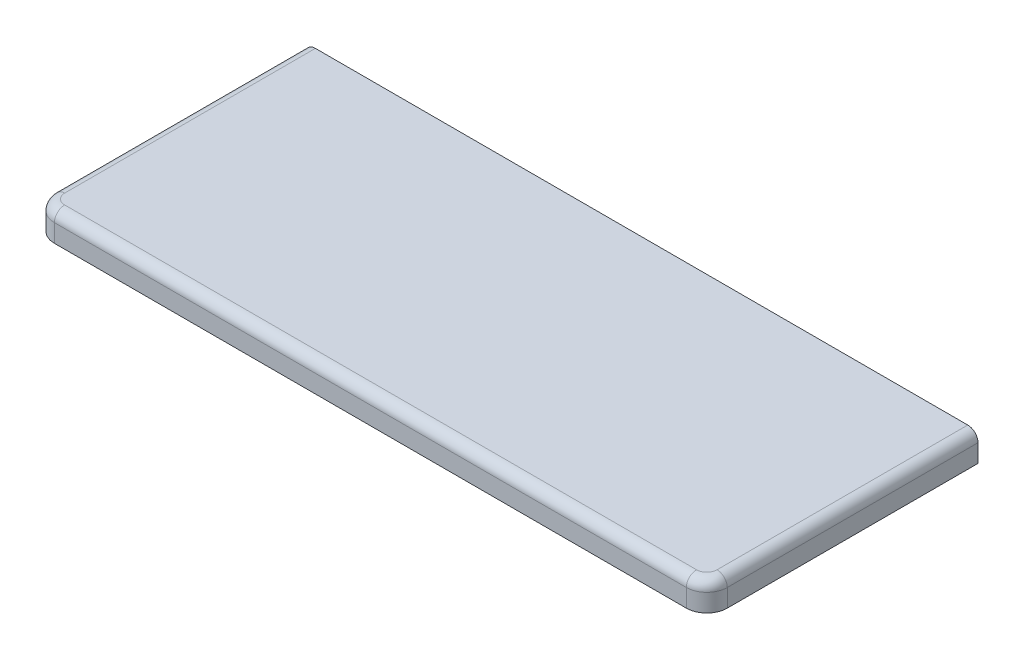
ISO-10303-21;
HEADER;
FILE_DESCRIPTION(('STEP AP214'),'2;1');
FILE_NAME('part.step','',(''),(''),'','','');
FILE_SCHEMA(('AUTOMOTIVE_DESIGN { 1 0 10303 214 1 1 1 1 }'));
ENDSEC;
DATA;
#1=APPLICATION_CONTEXT('core data for automotive mechanical design processes');
#2=APPLICATION_PROTOCOL_DEFINITION('international standard','automotive_design',2000,#1);
#3=PRODUCT_CONTEXT('',#1,'mechanical');
#4=PRODUCT('Part','Part','',(#3));
#5=PRODUCT_RELATED_PRODUCT_CATEGORY('part','',(#4));
#6=PRODUCT_DEFINITION_FORMATION('','',#4);
#7=PRODUCT_DEFINITION_CONTEXT('part definition',#1,'design');
#8=PRODUCT_DEFINITION('design','',#6,#7);
#9=PRODUCT_DEFINITION_SHAPE('','',#8);
#10=(LENGTH_UNIT() NAMED_UNIT(*) SI_UNIT(.MILLI.,.METRE.));
#11=(NAMED_UNIT(*) PLANE_ANGLE_UNIT() SI_UNIT($,.RADIAN.));
#12=(NAMED_UNIT(*) SI_UNIT($,.STERADIAN.) SOLID_ANGLE_UNIT());
#13=UNCERTAINTY_MEASURE_WITH_UNIT(LENGTH_MEASURE(1.E-05),#10,'distance_accuracy_value','');
#14=(GEOMETRIC_REPRESENTATION_CONTEXT(3) GLOBAL_UNCERTAINTY_ASSIGNED_CONTEXT((#13)) GLOBAL_UNIT_ASSIGNED_CONTEXT((#10,
#11,#12)) REPRESENTATION_CONTEXT('',''));
#15=CARTESIAN_POINT('',(0.,0.,0.));
#16=DIRECTION('',(0.,0.,1.));
#17=DIRECTION('',(1.,0.,0.));
#18=AXIS2_PLACEMENT_3D('',#15,#16,#17);
#19=CARTESIAN_POINT('',(32.875,2.75,19.));
#20=DIRECTION('',(-1.,0.,0.));
#21=DIRECTION('',(0.,0.,1.));
#22=AXIS2_PLACEMENT_3D('',#19,#20,#21);
#23=PLANE('',#22);
#24=DIRECTION('',(0.,1.,0.));
#25=VECTOR('',#24,1.);
#26=CARTESIAN_POINT('',(32.875,0.,-7.5));
#27=LINE('',#26,#25);
#28=CARTESIAN_POINT('',(32.875,0.,-7.5));
#29=VERTEX_POINT('',#28);
#30=CARTESIAN_POINT('',(32.875,1.75,-7.5));
#31=VERTEX_POINT('',#30);
#32=EDGE_CURVE('E122',#29,#31,#27,.T.);
#33=ORIENTED_EDGE('',*,*,#32,.T.);
#34=DIRECTION('',(0.,0.,-1.));
#35=VECTOR('',#34,1.);
#36=CARTESIAN_POINT('',(32.875,1.75,19.));
#37=LINE('',#36,#35);
#38=CARTESIAN_POINT('',(32.875,1.75,17.));
#39=VERTEX_POINT('',#38);
#40=EDGE_CURVE('E189',#31,#39,#37,.F.);
#41=ORIENTED_EDGE('',*,*,#40,.T.);
#42=DIRECTION('',(0.,-1.,0.));
#43=VECTOR('',#42,1.);
#44=CARTESIAN_POINT('',(32.875,2.75,17.));
#45=LINE('',#44,#43);
#46=CARTESIAN_POINT('',(32.875,0.,17.));
#47=VERTEX_POINT('',#46);
#48=EDGE_CURVE('E164',#39,#47,#45,.T.);
#49=ORIENTED_EDGE('',*,*,#48,.T.);
#50=DIRECTION('',(0.,0.,-1.));
#51=VECTOR('',#50,1.);
#52=CARTESIAN_POINT('',(32.875,0.,19.));
#53=LINE('',#52,#51);
#54=EDGE_CURVE('E142',#47,#29,#53,.T.);
#55=ORIENTED_EDGE('',*,*,#54,.T.);
#56=EDGE_LOOP('',(#33,#41,#49,#55));
#57=FACE_BOUND('',#56,.T.);
#58=ADVANCED_FACE('F40',(#57),#23,.F.);
#59=CARTESIAN_POINT('',(-32.875,2.75,19.));
#60=DIRECTION('',(1.,0.,0.));
#61=DIRECTION('',(0.,0.,-1.));
#62=AXIS2_PLACEMENT_3D('',#59,#60,#61);
#63=PLANE('',#62);
#64=DIRECTION('',(0.,-1.,0.));
#65=VECTOR('',#64,1.);
#66=CARTESIAN_POINT('',(-32.875,2.75,17.));
#67=LINE('',#66,#65);
#68=CARTESIAN_POINT('',(-32.875,0.,17.));
#69=VERTEX_POINT('',#68);
#70=CARTESIAN_POINT('',(-32.875,1.75,17.));
#71=VERTEX_POINT('',#70);
#72=EDGE_CURVE('E161',#69,#71,#67,.F.);
#73=ORIENTED_EDGE('',*,*,#72,.T.);
#74=DIRECTION('',(0.,0.,1.));
#75=VECTOR('',#74,1.);
#76=CARTESIAN_POINT('',(-32.875,1.75,19.));
#77=LINE('',#76,#75);
#78=CARTESIAN_POINT('',(-32.875,1.75,-7.5));
#79=VERTEX_POINT('',#78);
#80=EDGE_CURVE('E11',#71,#79,#77,.F.);
#81=ORIENTED_EDGE('',*,*,#80,.T.);
#82=DIRECTION('',(0.,1.,0.));
#83=VECTOR('',#82,1.);
#84=CARTESIAN_POINT('',(-32.875,0.,-7.5));
#85=LINE('',#84,#83);
#86=CARTESIAN_POINT('',(-32.875,0.,-7.5));
#87=VERTEX_POINT('',#86);
#88=EDGE_CURVE('E119',#87,#79,#85,.T.);
#89=ORIENTED_EDGE('',*,*,#88,.F.);
#90=DIRECTION('',(0.,0.,1.));
#91=VECTOR('',#90,1.);
#92=CARTESIAN_POINT('',(-32.875,0.,19.));
#93=LINE('',#92,#91);
#94=EDGE_CURVE('E132',#87,#69,#93,.T.);
#95=ORIENTED_EDGE('',*,*,#94,.T.);
#96=EDGE_LOOP('',(#73,#81,#89,#95));
#97=FACE_BOUND('',#96,.T.);
#98=ADVANCED_FACE('F131',(#97),#63,.F.);
#99=CARTESIAN_POINT('',(-32.875,2.75,19.));
#100=DIRECTION('',(0.,0.,-1.));
#101=DIRECTION('',(-1.,0.,0.));
#102=AXIS2_PLACEMENT_3D('',#99,#100,#101);
#103=PLANE('',#102);
#104=DIRECTION('',(0.,-1.,0.));
#105=VECTOR('',#104,1.);
#106=CARTESIAN_POINT('',(30.875,2.75,19.));
#107=LINE('',#106,#105);
#108=CARTESIAN_POINT('',(30.875,0.,19.));
#109=VERTEX_POINT('',#108);
#110=CARTESIAN_POINT('',(30.875,1.75,19.));
#111=VERTEX_POINT('',#110);
#112=EDGE_CURVE('E147',#109,#111,#107,.F.);
#113=ORIENTED_EDGE('',*,*,#112,.T.);
#114=DIRECTION('',(1.,0.,0.));
#115=VECTOR('',#114,1.);
#116=CARTESIAN_POINT('',(-32.875,1.75,19.));
#117=LINE('',#116,#115);
#118=CARTESIAN_POINT('',(-30.875,1.75,19.));
#119=VERTEX_POINT('',#118);
#120=EDGE_CURVE('E65',#111,#119,#117,.F.);
#121=ORIENTED_EDGE('',*,*,#120,.T.);
#122=DIRECTION('',(0.,-1.,0.));
#123=VECTOR('',#122,1.);
#124=CARTESIAN_POINT('',(-30.875,2.75,19.));
#125=LINE('',#124,#123);
#126=CARTESIAN_POINT('',(-30.875,0.,19.));
#127=VERTEX_POINT('',#126);
#128=EDGE_CURVE('E153',#119,#127,#125,.T.);
#129=ORIENTED_EDGE('',*,*,#128,.T.);
#130=DIRECTION('',(1.,0.,0.));
#131=VECTOR('',#130,1.);
#132=CARTESIAN_POINT('',(-32.875,0.,19.));
#133=LINE('',#132,#131);
#134=EDGE_CURVE('E141',#127,#109,#133,.T.);
#135=ORIENTED_EDGE('',*,*,#134,.T.);
#136=EDGE_LOOP('',(#113,#121,#129,#135));
#137=FACE_BOUND('',#136,.T.);
#138=ADVANCED_FACE('F238',(#137),#103,.F.);
#139=CARTESIAN_POINT('',(0.,2.75,0.));
#140=DIRECTION('',(0.,-1.,0.));
#141=DIRECTION('',(0.,0.,-1.));
#142=AXIS2_PLACEMENT_3D('',#139,#140,#141);
#143=PLANE('',#142);
#144=CARTESIAN_POINT('',(30.875,2.75,17.));
#145=DIRECTION('',(0.,-1.,0.));
#146=DIRECTION('',(0.,0.,-1.));
#147=AXIS2_PLACEMENT_3D('',#144,#145,#146);
#148=CIRCLE('',#147,1.);
#149=CARTESIAN_POINT('',(30.875,2.75,18.));
#150=VERTEX_POINT('',#149);
#151=CARTESIAN_POINT('',(31.875,2.75,17.));
#152=VERTEX_POINT('',#151);
#153=EDGE_CURVE('E176',#150,#152,#148,.F.);
#154=ORIENTED_EDGE('',*,*,#153,.T.);
#155=DIRECTION('',(0.,0.,-1.));
#156=VECTOR('',#155,1.);
#157=CARTESIAN_POINT('',(31.875,2.75,0.));
#158=LINE('',#157,#156);
#159=CARTESIAN_POINT('',(31.875,2.75,-7.5));
#160=VERTEX_POINT('',#159);
#161=EDGE_CURVE('E179',#152,#160,#158,.T.);
#162=ORIENTED_EDGE('',*,*,#161,.T.);
#163=DIRECTION('',(1.,0.,0.));
#164=VECTOR('',#163,1.);
#165=CARTESIAN_POINT('',(-32.875,2.75,-7.5));
#166=LINE('',#165,#164);
#167=CARTESIAN_POINT('',(-31.875,2.75,-7.5));
#168=VERTEX_POINT('',#167);
#169=EDGE_CURVE('E127',#168,#160,#166,.T.);
#170=ORIENTED_EDGE('',*,*,#169,.F.);
#171=DIRECTION('',(0.,0.,1.));
#172=VECTOR('',#171,1.);
#173=CARTESIAN_POINT('',(-31.875,2.75,0.));
#174=LINE('',#173,#172);
#175=CARTESIAN_POINT('',(-31.875,2.75,17.));
#176=VERTEX_POINT('',#175);
#177=EDGE_CURVE('E167',#168,#176,#174,.T.);
#178=ORIENTED_EDGE('',*,*,#177,.T.);
#179=CARTESIAN_POINT('',(-30.875,2.75,17.));
#180=DIRECTION('',(0.,-1.,0.));
#181=DIRECTION('',(0.,0.,-1.));
#182=AXIS2_PLACEMENT_3D('',#179,#180,#181);
#183=CIRCLE('',#182,1.);
#184=CARTESIAN_POINT('',(-30.875,2.75,18.));
#185=VERTEX_POINT('',#184);
#186=EDGE_CURVE('E170',#176,#185,#183,.F.);
#187=ORIENTED_EDGE('',*,*,#186,.T.);
#188=DIRECTION('',(1.,0.,0.));
#189=VECTOR('',#188,1.);
#190=CARTESIAN_POINT('',(0.,2.75,18.));
#191=LINE('',#190,#189);
#192=EDGE_CURVE('E173',#185,#150,#191,.T.);
#193=ORIENTED_EDGE('',*,*,#192,.T.);
#194=EDGE_LOOP('',(#154,#162,#170,#178,#187,#193));
#195=FACE_BOUND('',#194,.T.);
#196=ADVANCED_FACE('F241',(#195),#143,.F.);
#197=CARTESIAN_POINT('',(0.,0.,0.));
#198=DIRECTION('',(0.,-1.,0.));
#199=DIRECTION('',(0.,0.,-1.));
#200=AXIS2_PLACEMENT_3D('',#197,#198,#199);
#201=PLANE('',#200);
#202=ORIENTED_EDGE('',*,*,#134,.F.);
#203=CARTESIAN_POINT('',(-30.875,0.,17.));
#204=DIRECTION('',(0.,-1.,0.));
#205=DIRECTION('',(0.,0.,-1.));
#206=AXIS2_PLACEMENT_3D('',#203,#204,#205);
#207=CIRCLE('',#206,2.);
#208=EDGE_CURVE('E139',#127,#69,#207,.T.);
#209=ORIENTED_EDGE('',*,*,#208,.T.);
#210=ORIENTED_EDGE('',*,*,#94,.F.);
#211=DIRECTION('',(1.,0.,0.));
#212=VECTOR('',#211,1.);
#213=CARTESIAN_POINT('',(-32.875,0.,-7.5));
#214=LINE('',#213,#212);
#215=EDGE_CURVE('E115',#87,#29,#214,.T.);
#216=ORIENTED_EDGE('',*,*,#215,.T.);
#217=ORIENTED_EDGE('',*,*,#54,.F.);
#218=CARTESIAN_POINT('',(30.875,0.,17.));
#219=DIRECTION('',(0.,-1.,0.));
#220=DIRECTION('',(0.,0.,-1.));
#221=AXIS2_PLACEMENT_3D('',#218,#219,#220);
#222=CIRCLE('',#221,2.);
#223=EDGE_CURVE('E156',#47,#109,#222,.T.);
#224=ORIENTED_EDGE('',*,*,#223,.T.);
#225=EDGE_LOOP('',(#202,#209,#210,#216,#217,#224));
#226=FACE_BOUND('',#225,.T.);
#227=ADVANCED_FACE('F137',(#226),#201,.T.);
#228=CARTESIAN_POINT('',(-32.875,0.,-7.5));
#229=DIRECTION('',(0.,0.,1.));
#230=DIRECTION('',(1.,0.,0.));
#231=AXIS2_PLACEMENT_3D('',#228,#229,#230);
#232=PLANE('',#231);
#233=ORIENTED_EDGE('',*,*,#169,.T.);
#234=CARTESIAN_POINT('',(31.875,1.75,-7.5));
#235=DIRECTION('',(0.,0.,1.));
#236=DIRECTION('',(1.,0.,0.));
#237=AXIS2_PLACEMENT_3D('',#234,#235,#236);
#238=CIRCLE('',#237,1.);
#239=EDGE_CURVE('E186',#160,#31,#238,.F.);
#240=ORIENTED_EDGE('',*,*,#239,.T.);
#241=ORIENTED_EDGE('',*,*,#32,.F.);
#242=ORIENTED_EDGE('',*,*,#215,.F.);
#243=ORIENTED_EDGE('',*,*,#88,.T.);
#244=CARTESIAN_POINT('',(-31.875,1.75,-7.5));
#245=DIRECTION('',(0.,0.,1.));
#246=DIRECTION('',(1.,0.,0.));
#247=AXIS2_PLACEMENT_3D('',#244,#245,#246);
#248=CIRCLE('',#247,1.);
#249=EDGE_CURVE('E183',#79,#168,#248,.F.);
#250=ORIENTED_EDGE('',*,*,#249,.T.);
#251=EDGE_LOOP('',(#233,#240,#241,#242,#243,#250));
#252=FACE_BOUND('',#251,.T.);
#253=ADVANCED_FACE('F118',(#252),#232,.F.);
#254=CARTESIAN_POINT('',(-30.875,2.75,17.));
#255=DIRECTION('',(0.,-1.,0.));
#256=DIRECTION('',(0.,0.,-1.));
#257=AXIS2_PLACEMENT_3D('',#254,#255,#256);
#258=CYLINDRICAL_SURFACE('',#257,2.);
#259=ORIENTED_EDGE('',*,*,#128,.F.);
#260=CARTESIAN_POINT('',(-30.875,1.75,17.));
#261=DIRECTION('',(0.,-1.,0.));
#262=DIRECTION('',(0.,0.,-1.));
#263=AXIS2_PLACEMENT_3D('',#260,#261,#262);
#264=CIRCLE('',#263,2.);
#265=EDGE_CURVE('E50',#119,#71,#264,.T.);
#266=ORIENTED_EDGE('',*,*,#265,.T.);
#267=ORIENTED_EDGE('',*,*,#72,.F.);
#268=ORIENTED_EDGE('',*,*,#208,.F.);
#269=EDGE_LOOP('',(#259,#266,#267,#268));
#270=FACE_BOUND('',#269,.T.);
#271=ADVANCED_FACE('F260',(#270),#258,.T.);
#272=CARTESIAN_POINT('',(30.875,2.75,17.));
#273=DIRECTION('',(0.,-1.,0.));
#274=DIRECTION('',(0.,0.,-1.));
#275=AXIS2_PLACEMENT_3D('',#272,#273,#274);
#276=CYLINDRICAL_SURFACE('',#275,2.);
#277=ORIENTED_EDGE('',*,*,#48,.F.);
#278=CARTESIAN_POINT('',(30.875,1.75,17.));
#279=DIRECTION('',(0.,-1.,0.));
#280=DIRECTION('',(0.,0.,-1.));
#281=AXIS2_PLACEMENT_3D('',#278,#279,#280);
#282=CIRCLE('',#281,2.);
#283=EDGE_CURVE('E192',#39,#111,#282,.T.);
#284=ORIENTED_EDGE('',*,*,#283,.T.);
#285=ORIENTED_EDGE('',*,*,#112,.F.);
#286=ORIENTED_EDGE('',*,*,#223,.F.);
#287=EDGE_LOOP('',(#277,#284,#285,#286));
#288=FACE_BOUND('',#287,.T.);
#289=ADVANCED_FACE('F236',(#288),#276,.T.);
#290=CARTESIAN_POINT('',(-31.875,1.75,0.));
#291=DIRECTION('',(0.,0.,1.));
#292=DIRECTION('',(1.,0.,0.));
#293=AXIS2_PLACEMENT_3D('',#290,#291,#292);
#294=CYLINDRICAL_SURFACE('',#293,1.);
#295=ORIENTED_EDGE('',*,*,#249,.F.);
#296=ORIENTED_EDGE('',*,*,#80,.F.);
#297=CARTESIAN_POINT('',(-31.875,1.75,17.));
#298=DIRECTION('',(0.,0.,1.));
#299=DIRECTION('',(1.,0.,0.));
#300=AXIS2_PLACEMENT_3D('',#297,#298,#299);
#301=CIRCLE('',#300,1.);
#302=EDGE_CURVE('E44',#176,#71,#301,.T.);
#303=ORIENTED_EDGE('',*,*,#302,.F.);
#304=ORIENTED_EDGE('',*,*,#177,.F.);
#305=EDGE_LOOP('',(#295,#296,#303,#304));
#306=FACE_BOUND('',#305,.T.);
#307=ADVANCED_FACE('F42',(#306),#294,.T.);
#308=CARTESIAN_POINT('',(-30.875,1.75,17.));
#309=DIRECTION('',(0.,-1.,0.));
#310=DIRECTION('',(0.,0.,-1.));
#311=AXIS2_PLACEMENT_3D('',#308,#309,#310);
#312=DEGENERATE_TOROIDAL_SURFACE('',#311,1.,1.,.T.);
#313=ORIENTED_EDGE('',*,*,#302,.T.);
#314=ORIENTED_EDGE('',*,*,#265,.F.);
#315=CARTESIAN_POINT('',(-30.875,1.75,18.));
#316=DIRECTION('',(1.,0.,0.));
#317=DIRECTION('',(0.,0.,-1.));
#318=AXIS2_PLACEMENT_3D('',#315,#316,#317);
#319=CIRCLE('',#318,1.);
#320=EDGE_CURVE('E206',#185,#119,#319,.T.);
#321=ORIENTED_EDGE('',*,*,#320,.F.);
#322=ORIENTED_EDGE('',*,*,#186,.F.);
#323=EDGE_LOOP('',(#313,#314,#321,#322));
#324=FACE_BOUND('',#323,.T.);
#325=ADVANCED_FACE('F243',(#324),#312,.T.);
#326=CARTESIAN_POINT('',(0.,1.75,18.));
#327=DIRECTION('',(1.,0.,0.));
#328=DIRECTION('',(0.,0.,-1.));
#329=AXIS2_PLACEMENT_3D('',#326,#327,#328);
#330=CYLINDRICAL_SURFACE('',#329,1.);
#331=ORIENTED_EDGE('',*,*,#320,.T.);
#332=ORIENTED_EDGE('',*,*,#120,.F.);
#333=CARTESIAN_POINT('',(30.875,1.75,18.));
#334=DIRECTION('',(1.,0.,0.));
#335=DIRECTION('',(0.,0.,-1.));
#336=AXIS2_PLACEMENT_3D('',#333,#334,#335);
#337=CIRCLE('',#336,1.);
#338=EDGE_CURVE('E203',#150,#111,#337,.T.);
#339=ORIENTED_EDGE('',*,*,#338,.F.);
#340=ORIENTED_EDGE('',*,*,#192,.F.);
#341=EDGE_LOOP('',(#331,#332,#339,#340));
#342=FACE_BOUND('',#341,.T.);
#343=ADVANCED_FACE('F239',(#342),#330,.T.);
#344=CARTESIAN_POINT('',(30.875,1.75,17.));
#345=DIRECTION('',(0.,-1.,0.));
#346=DIRECTION('',(0.,0.,-1.));
#347=AXIS2_PLACEMENT_3D('',#344,#345,#346);
#348=DEGENERATE_TOROIDAL_SURFACE('',#347,1.,1.,.T.);
#349=ORIENTED_EDGE('',*,*,#338,.T.);
#350=ORIENTED_EDGE('',*,*,#283,.F.);
#351=CARTESIAN_POINT('',(31.875,1.75,17.));
#352=DIRECTION('',(0.,0.,-1.));
#353=DIRECTION('',(-1.,0.,0.));
#354=AXIS2_PLACEMENT_3D('',#351,#352,#353);
#355=CIRCLE('',#354,1.);
#356=EDGE_CURVE('E199',#152,#39,#355,.T.);
#357=ORIENTED_EDGE('',*,*,#356,.F.);
#358=ORIENTED_EDGE('',*,*,#153,.F.);
#359=EDGE_LOOP('',(#349,#350,#357,#358));
#360=FACE_BOUND('',#359,.T.);
#361=ADVANCED_FACE('F232',(#360),#348,.T.);
#362=CARTESIAN_POINT('',(31.875,1.75,0.));
#363=DIRECTION('',(0.,0.,-1.));
#364=DIRECTION('',(-1.,0.,0.));
#365=AXIS2_PLACEMENT_3D('',#362,#363,#364);
#366=CYLINDRICAL_SURFACE('',#365,1.);
#367=ORIENTED_EDGE('',*,*,#356,.T.);
#368=ORIENTED_EDGE('',*,*,#40,.F.);
#369=ORIENTED_EDGE('',*,*,#239,.F.);
#370=ORIENTED_EDGE('',*,*,#161,.F.);
#371=EDGE_LOOP('',(#367,#368,#369,#370));
#372=FACE_BOUND('',#371,.T.);
#373=ADVANCED_FACE('F226',(#372),#366,.T.);
#374=CLOSED_SHELL('',(#58,#98,#138,#196,#227,#253,#271,#289,#307,#325,#343,#361,#373));
#375=MANIFOLD_SOLID_BREP('B2',#374);
#376=ADVANCED_BREP_SHAPE_REPRESENTATION('',(#18,#375),#14);
#377=SHAPE_DEFINITION_REPRESENTATION(#9,#376);
ENDSEC;
END-ISO-10303-21;
